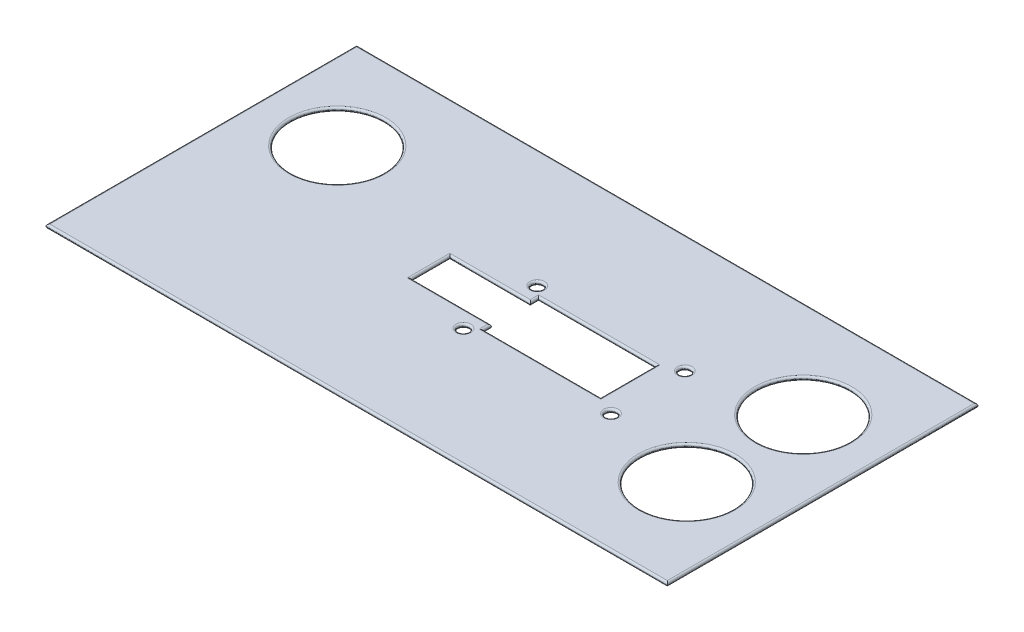
ISO-10303-21;
HEADER;
FILE_DESCRIPTION(('STEP AP214'),'2;1');
FILE_NAME('part.step','',(''),(''),'','','');
FILE_SCHEMA(('AUTOMOTIVE_DESIGN { 1 0 10303 214 1 1 1 1 }'));
ENDSEC;
DATA;
#1=APPLICATION_CONTEXT('core data for automotive mechanical design processes');
#2=APPLICATION_PROTOCOL_DEFINITION('international standard','automotive_design',2000,#1);
#3=PRODUCT_CONTEXT('',#1,'mechanical');
#4=PRODUCT('Part','Part','',(#3));
#5=PRODUCT_RELATED_PRODUCT_CATEGORY('part','',(#4));
#6=PRODUCT_DEFINITION_FORMATION('','',#4);
#7=PRODUCT_DEFINITION_CONTEXT('part definition',#1,'design');
#8=PRODUCT_DEFINITION('design','',#6,#7);
#9=PRODUCT_DEFINITION_SHAPE('','',#8);
#10=(LENGTH_UNIT() NAMED_UNIT(*) SI_UNIT(.MILLI.,.METRE.));
#11=(NAMED_UNIT(*) PLANE_ANGLE_UNIT() SI_UNIT($,.RADIAN.));
#12=(NAMED_UNIT(*) SI_UNIT($,.STERADIAN.) SOLID_ANGLE_UNIT());
#13=UNCERTAINTY_MEASURE_WITH_UNIT(LENGTH_MEASURE(1.E-05),#10,'distance_accuracy_value','');
#14=(GEOMETRIC_REPRESENTATION_CONTEXT(3) GLOBAL_UNCERTAINTY_ASSIGNED_CONTEXT((#13)) GLOBAL_UNIT_ASSIGNED_CONTEXT((#10,
#11,#12)) REPRESENTATION_CONTEXT('',''));
#15=CARTESIAN_POINT('',(0.,0.,0.));
#16=DIRECTION('',(0.,0.,1.));
#17=DIRECTION('',(1.,0.,0.));
#18=AXIS2_PLACEMENT_3D('',#15,#16,#17);
#19=CARTESIAN_POINT('',(0.,1.,0.));
#20=DIRECTION('',(0.,1.,0.));
#21=DIRECTION('',(0.,0.,1.));
#22=AXIS2_PLACEMENT_3D('',#19,#20,#21);
#23=PLANE('',#22);
#24=CARTESIAN_POINT('',(19.,1.,-9.5));
#25=DIRECTION('',(0.,1.,0.));
#26=DIRECTION('',(0.,0.,1.));
#27=AXIS2_PLACEMENT_3D('',#24,#25,#26);
#28=CIRCLE('',#27,1.9);
#29=CARTESIAN_POINT('',(19.,1.,-7.6));
#30=VERTEX_POINT('',#29);
#31=EDGE_CURVE('E11',#30,#30,#28,.F.);
#32=ORIENTED_EDGE('',*,*,#31,.T.);
#33=EDGE_LOOP('',(#32));
#34=FACE_BOUND('',#33,.T.);
#35=CARTESIAN_POINT('',(19.,1.,9.50000000000001));
#36=DIRECTION('',(0.,1.,0.));
#37=DIRECTION('',(0.,0.,1.));
#38=AXIS2_PLACEMENT_3D('',#35,#36,#37);
#39=CIRCLE('',#38,1.9);
#40=CARTESIAN_POINT('',(19.,1.,11.4));
#41=VERTEX_POINT('',#40);
#42=EDGE_CURVE('E47',#41,#41,#39,.F.);
#43=ORIENTED_EDGE('',*,*,#42,.T.);
#44=EDGE_LOOP('',(#43));
#45=FACE_BOUND('',#44,.T.);
#46=DIRECTION('',(-1.,0.,0.));
#47=VECTOR('',#46,1.);
#48=CARTESIAN_POINT('',(0.,1.,-7.65));
#49=LINE('',#48,#47);
#50=CARTESIAN_POINT('',(-16.8,1.,-7.65));
#51=VERTEX_POINT('',#50);
#52=CARTESIAN_POINT('',(14.5,1.,-7.65));
#53=VERTEX_POINT('',#52);
#54=EDGE_CURVE('E59',#51,#53,#49,.F.);
#55=ORIENTED_EDGE('',*,*,#54,.T.);
#56=DIRECTION('',(0.,0.,-1.));
#57=VECTOR('',#56,1.);
#58=CARTESIAN_POINT('',(14.5,1.,0.));
#59=LINE('',#58,#57);
#60=CARTESIAN_POINT('',(14.5,1.,7.65));
#61=VERTEX_POINT('',#60);
#62=EDGE_CURVE('E359',#53,#61,#59,.F.);
#63=ORIENTED_EDGE('',*,*,#62,.T.);
#64=DIRECTION('',(1.,0.,0.));
#65=VECTOR('',#64,1.);
#66=CARTESIAN_POINT('',(0.,1.,7.65));
#67=LINE('',#66,#65);
#68=CARTESIAN_POINT('',(-16.8,1.,7.65));
#69=VERTEX_POINT('',#68);
#70=EDGE_CURVE('E336',#61,#69,#67,.F.);
#71=ORIENTED_EDGE('',*,*,#70,.T.);
#72=DIRECTION('',(0.,0.,1.));
#73=VECTOR('',#72,1.);
#74=CARTESIAN_POINT('',(-16.8,1.,0.));
#75=LINE('',#74,#73);
#76=CARTESIAN_POINT('',(-16.8,1.,5.5));
#77=VERTEX_POINT('',#76);
#78=EDGE_CURVE('E344',#69,#77,#75,.F.);
#79=ORIENTED_EDGE('',*,*,#78,.T.);
#80=DIRECTION('',(1.,0.,0.));
#81=VECTOR('',#80,1.);
#82=CARTESIAN_POINT('',(0.,1.,5.5));
#83=LINE('',#82,#81);
#84=CARTESIAN_POINT('',(-37.5,1.,5.5));
#85=VERTEX_POINT('',#84);
#86=EDGE_CURVE('E347',#77,#85,#83,.F.);
#87=ORIENTED_EDGE('',*,*,#86,.T.);
#88=DIRECTION('',(0.,0.,1.));
#89=VECTOR('',#88,1.);
#90=CARTESIAN_POINT('',(-37.5,1.,0.));
#91=LINE('',#90,#89);
#92=CARTESIAN_POINT('',(-37.5,1.,-5.5));
#93=VERTEX_POINT('',#92);
#94=EDGE_CURVE('E349',#85,#93,#91,.F.);
#95=ORIENTED_EDGE('',*,*,#94,.T.);
#96=DIRECTION('',(-1.,0.,0.));
#97=VECTOR('',#96,1.);
#98=CARTESIAN_POINT('',(0.,1.,-5.5));
#99=LINE('',#98,#97);
#100=CARTESIAN_POINT('',(-16.8,1.,-5.5));
#101=VERTEX_POINT('',#100);
#102=EDGE_CURVE('E355',#93,#101,#99,.F.);
#103=ORIENTED_EDGE('',*,*,#102,.T.);
#104=DIRECTION('',(0.,0.,1.));
#105=VECTOR('',#104,1.);
#106=CARTESIAN_POINT('',(-16.8,1.,0.));
#107=LINE('',#106,#105);
#108=EDGE_CURVE('E351',#101,#51,#107,.F.);
#109=ORIENTED_EDGE('',*,*,#108,.T.);
#110=EDGE_LOOP('',(#55,#63,#71,#79,#87,#95,#103,#109));
#111=FACE_BOUND('',#110,.T.);
#112=CARTESIAN_POINT('',(44.,1.,15.));
#113=DIRECTION('',(0.,1.,0.));
#114=DIRECTION('',(0.,0.,1.));
#115=AXIS2_PLACEMENT_3D('',#112,#113,#114);
#116=CIRCLE('',#115,12.5);
#117=CARTESIAN_POINT('',(44.,1.,27.5));
#118=VERTEX_POINT('',#117);
#119=EDGE_CURVE('E340',#118,#118,#116,.F.);
#120=ORIENTED_EDGE('',*,*,#119,.T.);
#121=EDGE_LOOP('',(#120));
#122=FACE_BOUND('',#121,.T.);
#123=CARTESIAN_POINT('',(44.,1.,-15.));
#124=DIRECTION('',(0.,1.,0.));
#125=DIRECTION('',(0.,0.,1.));
#126=AXIS2_PLACEMENT_3D('',#123,#124,#125);
#127=CIRCLE('',#126,12.5);
#128=CARTESIAN_POINT('',(44.,1.,-2.49999999999998));
#129=VERTEX_POINT('',#128);
#130=EDGE_CURVE('E331',#129,#129,#127,.F.);
#131=ORIENTED_EDGE('',*,*,#130,.T.);
#132=EDGE_LOOP('',(#131));
#133=FACE_BOUND('',#132,.T.);
#134=DIRECTION('',(0.,0.,-1.));
#135=VECTOR('',#134,1.);
#136=CARTESIAN_POINT('',(63.5,1.,-40.));
#137=LINE('',#136,#135);
#138=CARTESIAN_POINT('',(63.5000000000001,1.,39.5));
#139=VERTEX_POINT('',#138);
#140=CARTESIAN_POINT('',(63.5,1.,-39.5));
#141=VERTEX_POINT('',#140);
#142=EDGE_CURVE('E328',#139,#141,#137,.T.);
#143=ORIENTED_EDGE('',*,*,#142,.T.);
#144=DIRECTION('',(-1.,0.,0.));
#145=VECTOR('',#144,1.);
#146=CARTESIAN_POINT('',(-96.,1.,-39.5));
#147=LINE('',#146,#145);
#148=CARTESIAN_POINT('',(-95.5,1.,-39.5));
#149=VERTEX_POINT('',#148);
#150=EDGE_CURVE('E335',#141,#149,#147,.T.);
#151=ORIENTED_EDGE('',*,*,#150,.T.);
#152=DIRECTION('',(0.,0.,1.));
#153=VECTOR('',#152,1.);
#154=CARTESIAN_POINT('',(-95.5,1.,40.));
#155=LINE('',#154,#153);
#156=CARTESIAN_POINT('',(-95.5,1.,39.5));
#157=VERTEX_POINT('',#156);
#158=EDGE_CURVE('E111',#149,#157,#155,.T.);
#159=ORIENTED_EDGE('',*,*,#158,.T.);
#160=DIRECTION('',(1.,0.,0.));
#161=VECTOR('',#160,1.);
#162=CARTESIAN_POINT('',(64.,1.,39.5));
#163=LINE('',#162,#161);
#164=EDGE_CURVE('E319',#157,#139,#163,.T.);
#165=ORIENTED_EDGE('',*,*,#164,.T.);
#166=EDGE_LOOP('',(#143,#151,#159,#165));
#167=FACE_BOUND('',#166,.T.);
#168=CARTESIAN_POINT('',(-76.,1.,-15.));
#169=DIRECTION('',(0.,1.,0.));
#170=DIRECTION('',(0.,0.,1.));
#171=AXIS2_PLACEMENT_3D('',#168,#169,#170);
#172=CIRCLE('',#171,12.5);
#173=CARTESIAN_POINT('',(-76.,1.,-2.50000000000001));
#174=VERTEX_POINT('',#173);
#175=EDGE_CURVE('E316',#174,#174,#172,.F.);
#176=ORIENTED_EDGE('',*,*,#175,.T.);
#177=EDGE_LOOP('',(#176));
#178=FACE_BOUND('',#177,.T.);
#179=CARTESIAN_POINT('',(-19.,1.,9.49999999999999));
#180=DIRECTION('',(0.,1.,0.));
#181=DIRECTION('',(0.,0.,1.));
#182=AXIS2_PLACEMENT_3D('',#179,#180,#181);
#183=CIRCLE('',#182,1.9);
#184=CARTESIAN_POINT('',(-19.,1.,11.4));
#185=VERTEX_POINT('',#184);
#186=EDGE_CURVE('E318',#185,#185,#183,.F.);
#187=ORIENTED_EDGE('',*,*,#186,.T.);
#188=EDGE_LOOP('',(#187));
#189=FACE_BOUND('',#188,.T.);
#190=CARTESIAN_POINT('',(-19.,1.,-9.5));
#191=DIRECTION('',(0.,1.,0.));
#192=DIRECTION('',(0.,0.,1.));
#193=AXIS2_PLACEMENT_3D('',#190,#191,#192);
#194=CIRCLE('',#193,1.9);
#195=CARTESIAN_POINT('',(-19.,1.,-7.6));
#196=VERTEX_POINT('',#195);
#197=EDGE_CURVE('E323',#196,#196,#194,.F.);
#198=ORIENTED_EDGE('',*,*,#197,.T.);
#199=EDGE_LOOP('',(#198));
#200=FACE_BOUND('',#199,.T.);
#201=ADVANCED_FACE('F39',(#34,#45,#111,#122,#133,#167,#178,#189,#200),#23,.T.);
#202=CARTESIAN_POINT('',(0.,0.,0.));
#203=DIRECTION('',(0.,1.,0.));
#204=DIRECTION('',(0.,0.,1.));
#205=AXIS2_PLACEMENT_3D('',#202,#203,#204);
#206=PLANE('',#205);
#207=CARTESIAN_POINT('',(19.,0.,-9.5));
#208=DIRECTION('',(0.,1.,0.));
#209=DIRECTION('',(0.,0.,1.));
#210=AXIS2_PLACEMENT_3D('',#207,#208,#209);
#211=CIRCLE('',#210,1.9);
#212=CARTESIAN_POINT('',(19.,0.,-7.6));
#213=VERTEX_POINT('',#212);
#214=EDGE_CURVE('E559',#213,#213,#211,.T.);
#215=ORIENTED_EDGE('',*,*,#214,.T.);
#216=EDGE_LOOP('',(#215));
#217=FACE_BOUND('',#216,.T.);
#218=CARTESIAN_POINT('',(-19.,0.,-9.5));
#219=DIRECTION('',(0.,1.,0.));
#220=DIRECTION('',(0.,0.,1.));
#221=AXIS2_PLACEMENT_3D('',#218,#219,#220);
#222=CIRCLE('',#221,1.9);
#223=CARTESIAN_POINT('',(-19.,0.,-7.6));
#224=VERTEX_POINT('',#223);
#225=EDGE_CURVE('E557',#224,#224,#222,.T.);
#226=ORIENTED_EDGE('',*,*,#225,.T.);
#227=EDGE_LOOP('',(#226));
#228=FACE_BOUND('',#227,.T.);
#229=CARTESIAN_POINT('',(19.,0.,9.50000000000001));
#230=DIRECTION('',(0.,1.,0.));
#231=DIRECTION('',(0.,0.,1.));
#232=AXIS2_PLACEMENT_3D('',#229,#230,#231);
#233=CIRCLE('',#232,1.9);
#234=CARTESIAN_POINT('',(19.,0.,11.4));
#235=VERTEX_POINT('',#234);
#236=EDGE_CURVE('E554',#235,#235,#233,.T.);
#237=ORIENTED_EDGE('',*,*,#236,.T.);
#238=EDGE_LOOP('',(#237));
#239=FACE_BOUND('',#238,.T.);
#240=CARTESIAN_POINT('',(-19.,0.,9.49999999999999));
#241=DIRECTION('',(0.,1.,0.));
#242=DIRECTION('',(0.,0.,1.));
#243=AXIS2_PLACEMENT_3D('',#240,#241,#242);
#244=CIRCLE('',#243,1.9);
#245=CARTESIAN_POINT('',(-19.,0.,11.4));
#246=VERTEX_POINT('',#245);
#247=EDGE_CURVE('E546',#246,#246,#244,.T.);
#248=ORIENTED_EDGE('',*,*,#247,.T.);
#249=EDGE_LOOP('',(#248));
#250=FACE_BOUND('',#249,.T.);
#251=DIRECTION('',(0.,0.,1.));
#252=VECTOR('',#251,1.);
#253=CARTESIAN_POINT('',(-37.5,0.,5.));
#254=LINE('',#253,#252);
#255=CARTESIAN_POINT('',(-37.5,0.,-5.5));
#256=VERTEX_POINT('',#255);
#257=CARTESIAN_POINT('',(-37.5,0.,5.5));
#258=VERTEX_POINT('',#257);
#259=EDGE_CURVE('E539',#256,#258,#254,.T.);
#260=ORIENTED_EDGE('',*,*,#259,.T.);
#261=DIRECTION('',(1.,0.,0.));
#262=VECTOR('',#261,1.);
#263=CARTESIAN_POINT('',(-16.3,0.,5.5));
#264=LINE('',#263,#262);
#265=CARTESIAN_POINT('',(-16.8,0.,5.5));
#266=VERTEX_POINT('',#265);
#267=EDGE_CURVE('E542',#258,#266,#264,.T.);
#268=ORIENTED_EDGE('',*,*,#267,.T.);
#269=DIRECTION('',(0.,0.,1.));
#270=VECTOR('',#269,1.);
#271=CARTESIAN_POINT('',(-16.8,0.,7.15));
#272=LINE('',#271,#270);
#273=CARTESIAN_POINT('',(-16.8,0.,7.65));
#274=VERTEX_POINT('',#273);
#275=EDGE_CURVE('E596',#266,#274,#272,.T.);
#276=ORIENTED_EDGE('',*,*,#275,.T.);
#277=DIRECTION('',(1.,0.,0.));
#278=VECTOR('',#277,1.);
#279=CARTESIAN_POINT('',(14.,0.,7.65));
#280=LINE('',#279,#278);
#281=CARTESIAN_POINT('',(14.5,0.,7.65));
#282=VERTEX_POINT('',#281);
#283=EDGE_CURVE('E598',#274,#282,#280,.T.);
#284=ORIENTED_EDGE('',*,*,#283,.T.);
#285=DIRECTION('',(0.,0.,-1.));
#286=VECTOR('',#285,1.);
#287=CARTESIAN_POINT('',(14.5,0.,-7.15));
#288=LINE('',#287,#286);
#289=CARTESIAN_POINT('',(14.5,0.,-7.65));
#290=VERTEX_POINT('',#289);
#291=EDGE_CURVE('E599',#282,#290,#288,.T.);
#292=ORIENTED_EDGE('',*,*,#291,.T.);
#293=DIRECTION('',(-1.,0.,0.));
#294=VECTOR('',#293,1.);
#295=CARTESIAN_POINT('',(-16.3,0.,-7.65));
#296=LINE('',#295,#294);
#297=CARTESIAN_POINT('',(-16.8,0.,-7.65));
#298=VERTEX_POINT('',#297);
#299=EDGE_CURVE('E526',#290,#298,#296,.T.);
#300=ORIENTED_EDGE('',*,*,#299,.T.);
#301=DIRECTION('',(0.,0.,1.));
#302=VECTOR('',#301,1.);
#303=CARTESIAN_POINT('',(-16.8,0.,-5.));
#304=LINE('',#303,#302);
#305=CARTESIAN_POINT('',(-16.8,0.,-5.5));
#306=VERTEX_POINT('',#305);
#307=EDGE_CURVE('E523',#298,#306,#304,.T.);
#308=ORIENTED_EDGE('',*,*,#307,.T.);
#309=DIRECTION('',(-1.,0.,0.));
#310=VECTOR('',#309,1.);
#311=CARTESIAN_POINT('',(-37.,0.,-5.5));
#312=LINE('',#311,#310);
#313=EDGE_CURVE('E522',#306,#256,#312,.T.);
#314=ORIENTED_EDGE('',*,*,#313,.T.);
#315=EDGE_LOOP('',(#260,#268,#276,#284,#292,#300,#308,#314));
#316=FACE_BOUND('',#315,.T.);
#317=DIRECTION('',(0.,0.,-1.));
#318=VECTOR('',#317,1.);
#319=CARTESIAN_POINT('',(63.5,0.,0.));
#320=LINE('',#319,#318);
#321=CARTESIAN_POINT('',(63.5,0.,-39.5));
#322=VERTEX_POINT('',#321);
#323=CARTESIAN_POINT('',(63.5000000000001,0.,39.5));
#324=VERTEX_POINT('',#323);
#325=EDGE_CURVE('E469',#322,#324,#320,.F.);
#326=ORIENTED_EDGE('',*,*,#325,.T.);
#327=DIRECTION('',(1.,0.,0.));
#328=VECTOR('',#327,1.);
#329=CARTESIAN_POINT('',(0.,0.,39.5));
#330=LINE('',#329,#328);
#331=CARTESIAN_POINT('',(-95.5,0.,39.5));
#332=VERTEX_POINT('',#331);
#333=EDGE_CURVE('E592',#324,#332,#330,.F.);
#334=ORIENTED_EDGE('',*,*,#333,.T.);
#335=DIRECTION('',(0.,0.,1.));
#336=VECTOR('',#335,1.);
#337=CARTESIAN_POINT('',(-95.5,0.,0.));
#338=LINE('',#337,#336);
#339=CARTESIAN_POINT('',(-95.5,0.,-39.5));
#340=VERTEX_POINT('',#339);
#341=EDGE_CURVE('E587',#332,#340,#338,.F.);
#342=ORIENTED_EDGE('',*,*,#341,.T.);
#343=DIRECTION('',(-1.,0.,0.));
#344=VECTOR('',#343,1.);
#345=CARTESIAN_POINT('',(0.,0.,-39.5));
#346=LINE('',#345,#344);
#347=EDGE_CURVE('E132',#340,#322,#346,.F.);
#348=ORIENTED_EDGE('',*,*,#347,.T.);
#349=EDGE_LOOP('',(#326,#334,#342,#348));
#350=FACE_BOUND('',#349,.T.);
#351=CARTESIAN_POINT('',(44.,0.,-15.));
#352=DIRECTION('',(0.,1.,0.));
#353=DIRECTION('',(0.,0.,1.));
#354=AXIS2_PLACEMENT_3D('',#351,#352,#353);
#355=CIRCLE('',#354,12.5);
#356=CARTESIAN_POINT('',(44.,0.,-2.49999999999998));
#357=VERTEX_POINT('',#356);
#358=EDGE_CURVE('E578',#357,#357,#355,.T.);
#359=ORIENTED_EDGE('',*,*,#358,.T.);
#360=EDGE_LOOP('',(#359));
#361=FACE_BOUND('',#360,.T.);
#362=CARTESIAN_POINT('',(-76.,0.,-15.));
#363=DIRECTION('',(0.,1.,0.));
#364=DIRECTION('',(0.,0.,1.));
#365=AXIS2_PLACEMENT_3D('',#362,#363,#364);
#366=CIRCLE('',#365,12.5);
#367=CARTESIAN_POINT('',(-76.,0.,-2.50000000000001));
#368=VERTEX_POINT('',#367);
#369=EDGE_CURVE('E581',#368,#368,#366,.T.);
#370=ORIENTED_EDGE('',*,*,#369,.T.);
#371=EDGE_LOOP('',(#370));
#372=FACE_BOUND('',#371,.T.);
#373=CARTESIAN_POINT('',(44.,0.,15.));
#374=DIRECTION('',(0.,1.,0.));
#375=DIRECTION('',(0.,0.,1.));
#376=AXIS2_PLACEMENT_3D('',#373,#374,#375);
#377=CIRCLE('',#376,12.5);
#378=CARTESIAN_POINT('',(44.,0.,27.5));
#379=VERTEX_POINT('',#378);
#380=EDGE_CURVE('E364',#379,#379,#377,.T.);
#381=ORIENTED_EDGE('',*,*,#380,.T.);
#382=EDGE_LOOP('',(#381));
#383=FACE_BOUND('',#382,.T.);
#384=ADVANCED_FACE('F172',(#217,#228,#239,#250,#316,#350,#361,#372,#383),#206,.F.);
#385=CARTESIAN_POINT('',(19.,0.5,-9.5));
#386=DIRECTION('',(0.,1.,0.));
#387=DIRECTION('',(0.,0.,1.));
#388=AXIS2_PLACEMENT_3D('',#385,#386,#387);
#389=TOROIDAL_SURFACE('',#388,1.9,0.5);
#390=ORIENTED_EDGE('',*,*,#31,.F.);
#391=EDGE_LOOP('',(#390));
#392=FACE_BOUND('',#391,.T.);
#393=CARTESIAN_POINT('',(19.,0.5,-9.5));
#394=DIRECTION('',(0.,1.,0.));
#395=DIRECTION('',(0.,0.,1.));
#396=AXIS2_PLACEMENT_3D('',#393,#394,#395);
#397=CIRCLE('',#396,1.4);
#398=CARTESIAN_POINT('',(19.,0.5,-8.1));
#399=VERTEX_POINT('',#398);
#400=EDGE_CURVE('E362',#399,#399,#397,.T.);
#401=ORIENTED_EDGE('',*,*,#400,.F.);
#402=EDGE_LOOP('',(#401));
#403=FACE_BOUND('',#402,.T.);
#404=ADVANCED_FACE('F177',(#392,#403),#389,.T.);
#405=CARTESIAN_POINT('',(19.,0.5,-9.5));
#406=DIRECTION('',(0.,1.,0.));
#407=DIRECTION('',(0.,0.,1.));
#408=AXIS2_PLACEMENT_3D('',#405,#406,#407);
#409=TOROIDAL_SURFACE('',#408,1.9,0.5);
#410=ORIENTED_EDGE('',*,*,#400,.T.);
#411=EDGE_LOOP('',(#410));
#412=FACE_BOUND('',#411,.T.);
#413=ORIENTED_EDGE('',*,*,#214,.F.);
#414=EDGE_LOOP('',(#413));
#415=FACE_BOUND('',#414,.T.);
#416=ADVANCED_FACE('F185',(#412,#415),#409,.T.);
#417=CARTESIAN_POINT('',(-19.,0.5,-9.5));
#418=DIRECTION('',(0.,1.,0.));
#419=DIRECTION('',(0.,0.,1.));
#420=AXIS2_PLACEMENT_3D('',#417,#418,#419);
#421=TOROIDAL_SURFACE('',#420,1.9,0.5);
#422=ORIENTED_EDGE('',*,*,#197,.F.);
#423=EDGE_LOOP('',(#422));
#424=FACE_BOUND('',#423,.T.);
#425=CARTESIAN_POINT('',(-19.,0.5,-9.5));
#426=DIRECTION('',(0.,1.,0.));
#427=DIRECTION('',(0.,0.,1.));
#428=AXIS2_PLACEMENT_3D('',#425,#426,#427);
#429=CIRCLE('',#428,1.4);
#430=CARTESIAN_POINT('',(-19.,0.5,-8.1));
#431=VERTEX_POINT('',#430);
#432=EDGE_CURVE('E368',#431,#431,#429,.T.);
#433=ORIENTED_EDGE('',*,*,#432,.F.);
#434=EDGE_LOOP('',(#433));
#435=FACE_BOUND('',#434,.T.);
#436=ADVANCED_FACE('F183',(#424,#435),#421,.T.);
#437=CARTESIAN_POINT('',(-19.,0.5,-9.5));
#438=DIRECTION('',(0.,1.,0.));
#439=DIRECTION('',(0.,0.,1.));
#440=AXIS2_PLACEMENT_3D('',#437,#438,#439);
#441=TOROIDAL_SURFACE('',#440,1.9,0.5);
#442=ORIENTED_EDGE('',*,*,#432,.T.);
#443=EDGE_LOOP('',(#442));
#444=FACE_BOUND('',#443,.T.);
#445=ORIENTED_EDGE('',*,*,#225,.F.);
#446=EDGE_LOOP('',(#445));
#447=FACE_BOUND('',#446,.T.);
#448=ADVANCED_FACE('F186',(#444,#447),#441,.T.);
#449=CARTESIAN_POINT('',(19.,0.5,9.50000000000001));
#450=DIRECTION('',(0.,1.,0.));
#451=DIRECTION('',(0.,0.,1.));
#452=AXIS2_PLACEMENT_3D('',#449,#450,#451);
#453=TOROIDAL_SURFACE('',#452,1.9,0.5);
#454=ORIENTED_EDGE('',*,*,#42,.F.);
#455=EDGE_LOOP('',(#454));
#456=FACE_BOUND('',#455,.T.);
#457=CARTESIAN_POINT('',(19.,0.5,9.50000000000001));
#458=DIRECTION('',(0.,1.,0.));
#459=DIRECTION('',(0.,0.,1.));
#460=AXIS2_PLACEMENT_3D('',#457,#458,#459);
#461=CIRCLE('',#460,1.4);
#462=CARTESIAN_POINT('',(19.,0.5,10.9));
#463=VERTEX_POINT('',#462);
#464=EDGE_CURVE('E369',#463,#463,#461,.T.);
#465=ORIENTED_EDGE('',*,*,#464,.F.);
#466=EDGE_LOOP('',(#465));
#467=FACE_BOUND('',#466,.T.);
#468=ADVANCED_FACE('F194',(#456,#467),#453,.T.);
#469=CARTESIAN_POINT('',(19.,0.5,9.50000000000001));
#470=DIRECTION('',(0.,1.,0.));
#471=DIRECTION('',(0.,0.,1.));
#472=AXIS2_PLACEMENT_3D('',#469,#470,#471);
#473=TOROIDAL_SURFACE('',#472,1.9,0.5);
#474=ORIENTED_EDGE('',*,*,#464,.T.);
#475=EDGE_LOOP('',(#474));
#476=FACE_BOUND('',#475,.T.);
#477=ORIENTED_EDGE('',*,*,#236,.F.);
#478=EDGE_LOOP('',(#477));
#479=FACE_BOUND('',#478,.T.);
#480=ADVANCED_FACE('F196',(#476,#479),#473,.T.);
#481=CARTESIAN_POINT('',(-19.,0.5,9.49999999999999));
#482=DIRECTION('',(0.,1.,0.));
#483=DIRECTION('',(0.,0.,1.));
#484=AXIS2_PLACEMENT_3D('',#481,#482,#483);
#485=TOROIDAL_SURFACE('',#484,1.9,0.5);
#486=ORIENTED_EDGE('',*,*,#186,.F.);
#487=EDGE_LOOP('',(#486));
#488=FACE_BOUND('',#487,.T.);
#489=CARTESIAN_POINT('',(-19.,0.5,9.49999999999999));
#490=DIRECTION('',(0.,1.,0.));
#491=DIRECTION('',(0.,0.,1.));
#492=AXIS2_PLACEMENT_3D('',#489,#490,#491);
#493=CIRCLE('',#492,1.4);
#494=CARTESIAN_POINT('',(-19.,0.5,10.9));
#495=VERTEX_POINT('',#494);
#496=EDGE_CURVE('E375',#495,#495,#493,.T.);
#497=ORIENTED_EDGE('',*,*,#496,.F.);
#498=EDGE_LOOP('',(#497));
#499=FACE_BOUND('',#498,.T.);
#500=ADVANCED_FACE('F203',(#488,#499),#485,.T.);
#501=CARTESIAN_POINT('',(-19.,0.5,9.49999999999999));
#502=DIRECTION('',(0.,1.,0.));
#503=DIRECTION('',(0.,0.,1.));
#504=AXIS2_PLACEMENT_3D('',#501,#502,#503);
#505=TOROIDAL_SURFACE('',#504,1.9,0.5);
#506=ORIENTED_EDGE('',*,*,#496,.T.);
#507=EDGE_LOOP('',(#506));
#508=FACE_BOUND('',#507,.T.);
#509=ORIENTED_EDGE('',*,*,#247,.F.);
#510=EDGE_LOOP('',(#509));
#511=FACE_BOUND('',#510,.T.);
#512=ADVANCED_FACE('F206',(#508,#511),#505,.T.);
#513=CARTESIAN_POINT('',(-16.3,0.5,-7.65));
#514=DIRECTION('',(-1.,0.,0.));
#515=DIRECTION('',(0.,0.,1.));
#516=AXIS2_PLACEMENT_3D('',#513,#514,#515);
#517=CYLINDRICAL_SURFACE('',#516,0.5);
#518=CARTESIAN_POINT('',(14.5,0.5,-7.65));
#519=DIRECTION('',(-0.707106781186548,0.,-0.707106781186547));
#520=DIRECTION('',(0.707106781186547,0.,-0.707106781186548));
#521=AXIS2_PLACEMENT_3D('',#518,#519,#520);
#522=ELLIPSE('',#521,0.707106781186547,0.5);
#523=CARTESIAN_POINT('',(14.,0.5,-7.15));
#524=VERTEX_POINT('',#523);
#525=EDGE_CURVE('E440',#53,#524,#522,.F.);
#526=ORIENTED_EDGE('',*,*,#525,.F.);
#527=ORIENTED_EDGE('',*,*,#54,.F.);
#528=CARTESIAN_POINT('',(-16.8,0.5,-7.65));
#529=DIRECTION('',(-0.707106781186549,0.,0.707106781186546));
#530=DIRECTION('',(-0.707106781186546,0.,-0.707106781186549));
#531=AXIS2_PLACEMENT_3D('',#528,#529,#530);
#532=ELLIPSE('',#531,0.707106781186546,0.5);
#533=CARTESIAN_POINT('',(-16.3,0.5,-7.15));
#534=VERTEX_POINT('',#533);
#535=EDGE_CURVE('E374',#534,#51,#532,.T.);
#536=ORIENTED_EDGE('',*,*,#535,.F.);
#537=DIRECTION('',(-1.,0.,0.));
#538=VECTOR('',#537,1.);
#539=CARTESIAN_POINT('',(-16.3,0.5,-7.15));
#540=LINE('',#539,#538);
#541=EDGE_CURVE('E439',#524,#534,#540,.T.);
#542=ORIENTED_EDGE('',*,*,#541,.F.);
#543=EDGE_LOOP('',(#526,#527,#536,#542));
#544=FACE_BOUND('',#543,.T.);
#545=ADVANCED_FACE('F207',(#544),#517,.T.);
#546=CARTESIAN_POINT('',(-16.8,0.5,-5.));
#547=DIRECTION('',(0.,0.,1.));
#548=DIRECTION('',(1.,0.,0.));
#549=AXIS2_PLACEMENT_3D('',#546,#547,#548);
#550=CYLINDRICAL_SURFACE('',#549,0.5);
#551=ORIENTED_EDGE('',*,*,#535,.T.);
#552=ORIENTED_EDGE('',*,*,#108,.F.);
#553=CARTESIAN_POINT('',(-16.8,0.5,-5.5));
#554=DIRECTION('',(-0.707106781186549,0.,0.707106781186546));
#555=DIRECTION('',(-0.707106781186546,0.,-0.707106781186549));
#556=AXIS2_PLACEMENT_3D('',#553,#554,#555);
#557=ELLIPSE('',#556,0.707106781186546,0.5);
#558=CARTESIAN_POINT('',(-16.3,0.5,-5.));
#559=VERTEX_POINT('',#558);
#560=EDGE_CURVE('E432',#559,#101,#557,.T.);
#561=ORIENTED_EDGE('',*,*,#560,.F.);
#562=DIRECTION('',(0.,0.,1.));
#563=VECTOR('',#562,1.);
#564=CARTESIAN_POINT('',(-16.3,0.5,-5.));
#565=LINE('',#564,#563);
#566=EDGE_CURVE('E431',#534,#559,#565,.T.);
#567=ORIENTED_EDGE('',*,*,#566,.F.);
#568=EDGE_LOOP('',(#551,#552,#561,#567));
#569=FACE_BOUND('',#568,.T.);
#570=ADVANCED_FACE('F267',(#569),#550,.T.);
#571=CARTESIAN_POINT('',(0.,0.5,-7.65));
#572=DIRECTION('',(1.,0.,0.));
#573=DIRECTION('',(0.,0.,-1.));
#574=AXIS2_PLACEMENT_3D('',#571,#572,#573);
#575=CYLINDRICAL_SURFACE('',#574,0.5);
#576=CARTESIAN_POINT('',(14.5,0.5,-7.65));
#577=DIRECTION('',(0.707106781186548,0.,0.707106781186547));
#578=DIRECTION('',(0.707106781186547,0.,-0.707106781186548));
#579=AXIS2_PLACEMENT_3D('',#576,#577,#578);
#580=ELLIPSE('',#579,0.707106781186547,0.5);
#581=EDGE_CURVE('E422',#524,#290,#580,.T.);
#582=ORIENTED_EDGE('',*,*,#581,.F.);
#583=ORIENTED_EDGE('',*,*,#541,.T.);
#584=CARTESIAN_POINT('',(-16.8,0.5,-7.65));
#585=DIRECTION('',(0.707106781186549,0.,-0.707106781186546));
#586=DIRECTION('',(-0.707106781186546,0.,-0.707106781186549));
#587=AXIS2_PLACEMENT_3D('',#584,#585,#586);
#588=ELLIPSE('',#587,0.707106781186546,0.5);
#589=EDGE_CURVE('E428',#298,#534,#588,.F.);
#590=ORIENTED_EDGE('',*,*,#589,.F.);
#591=ORIENTED_EDGE('',*,*,#299,.F.);
#592=EDGE_LOOP('',(#582,#583,#590,#591));
#593=FACE_BOUND('',#592,.T.);
#594=ADVANCED_FACE('F264',(#593),#575,.T.);
#595=CARTESIAN_POINT('',(14.5,0.5,-7.15));
#596=DIRECTION('',(0.,0.,-1.));
#597=DIRECTION('',(-1.,0.,0.));
#598=AXIS2_PLACEMENT_3D('',#595,#596,#597);
#599=CYLINDRICAL_SURFACE('',#598,0.5);
#600=ORIENTED_EDGE('',*,*,#62,.F.);
#601=ORIENTED_EDGE('',*,*,#525,.T.);
#602=DIRECTION('',(0.,0.,-1.));
#603=VECTOR('',#602,1.);
#604=CARTESIAN_POINT('',(14.,0.5,-7.15));
#605=LINE('',#604,#603);
#606=CARTESIAN_POINT('',(14.,0.5,7.15));
#607=VERTEX_POINT('',#606);
#608=EDGE_CURVE('E425',#607,#524,#605,.T.);
#609=ORIENTED_EDGE('',*,*,#608,.F.);
#610=CARTESIAN_POINT('',(14.5,0.5,7.65));
#611=DIRECTION('',(0.707106781186547,0.,-0.707106781186548));
#612=DIRECTION('',(-0.707106781186548,0.,-0.707106781186547));
#613=AXIS2_PLACEMENT_3D('',#610,#611,#612);
#614=ELLIPSE('',#613,0.707106781186548,0.5);
#615=EDGE_CURVE('E420',#61,#607,#614,.F.);
#616=ORIENTED_EDGE('',*,*,#615,.F.);
#617=EDGE_LOOP('',(#600,#601,#609,#616));
#618=FACE_BOUND('',#617,.T.);
#619=ADVANCED_FACE('F261',(#618),#599,.T.);
#620=CARTESIAN_POINT('',(-37.,0.5,-5.5));
#621=DIRECTION('',(-1.,0.,0.));
#622=DIRECTION('',(0.,0.,1.));
#623=AXIS2_PLACEMENT_3D('',#620,#621,#622);
#624=CYLINDRICAL_SURFACE('',#623,0.5);
#625=ORIENTED_EDGE('',*,*,#560,.T.);
#626=ORIENTED_EDGE('',*,*,#102,.F.);
#627=CARTESIAN_POINT('',(-37.5,0.5,-5.5));
#628=DIRECTION('',(-0.707106781186547,0.,0.707106781186548));
#629=DIRECTION('',(-0.707106781186548,0.,-0.707106781186547));
#630=AXIS2_PLACEMENT_3D('',#627,#628,#629);
#631=ELLIPSE('',#630,0.707106781186547,0.5);
#632=CARTESIAN_POINT('',(-37.,0.5,-5.));
#633=VERTEX_POINT('',#632);
#634=EDGE_CURVE('E418',#633,#93,#631,.T.);
#635=ORIENTED_EDGE('',*,*,#634,.F.);
#636=DIRECTION('',(-1.,0.,0.));
#637=VECTOR('',#636,1.);
#638=CARTESIAN_POINT('',(-37.,0.5,-5.));
#639=LINE('',#638,#637);
#640=EDGE_CURVE('E414',#559,#633,#639,.T.);
#641=ORIENTED_EDGE('',*,*,#640,.F.);
#642=EDGE_LOOP('',(#625,#626,#635,#641));
#643=FACE_BOUND('',#642,.T.);
#644=ADVANCED_FACE('F260',(#643),#624,.T.);
#645=CARTESIAN_POINT('',(-16.8,0.5,0.));
#646=DIRECTION('',(0.,0.,-1.));
#647=DIRECTION('',(-1.,0.,0.));
#648=AXIS2_PLACEMENT_3D('',#645,#646,#647);
#649=CYLINDRICAL_SURFACE('',#648,0.5);
#650=ORIENTED_EDGE('',*,*,#589,.T.);
#651=ORIENTED_EDGE('',*,*,#566,.T.);
#652=CARTESIAN_POINT('',(-16.8,0.5,-5.5));
#653=DIRECTION('',(0.707106781186549,0.,-0.707106781186546));
#654=DIRECTION('',(-0.707106781186546,0.,-0.707106781186549));
#655=AXIS2_PLACEMENT_3D('',#652,#653,#654);
#656=ELLIPSE('',#655,0.707106781186546,0.5);
#657=EDGE_CURVE('E406',#306,#559,#656,.F.);
#658=ORIENTED_EDGE('',*,*,#657,.F.);
#659=ORIENTED_EDGE('',*,*,#307,.F.);
#660=EDGE_LOOP('',(#650,#651,#658,#659));
#661=FACE_BOUND('',#660,.T.);
#662=ADVANCED_FACE('F251',(#661),#649,.T.);
#663=CARTESIAN_POINT('',(14.5,0.5,0.));
#664=DIRECTION('',(0.,0.,1.));
#665=DIRECTION('',(1.,0.,0.));
#666=AXIS2_PLACEMENT_3D('',#663,#664,#665);
#667=CYLINDRICAL_SURFACE('',#666,0.5);
#668=ORIENTED_EDGE('',*,*,#581,.T.);
#669=ORIENTED_EDGE('',*,*,#291,.F.);
#670=CARTESIAN_POINT('',(14.5,0.5,7.65));
#671=DIRECTION('',(-0.707106781186547,0.,0.707106781186548));
#672=DIRECTION('',(0.707106781186548,0.,0.707106781186547));
#673=AXIS2_PLACEMENT_3D('',#670,#671,#672);
#674=ELLIPSE('',#673,0.707106781186548,0.5);
#675=EDGE_CURVE('E410',#607,#282,#674,.T.);
#676=ORIENTED_EDGE('',*,*,#675,.F.);
#677=ORIENTED_EDGE('',*,*,#608,.T.);
#678=EDGE_LOOP('',(#668,#669,#676,#677));
#679=FACE_BOUND('',#678,.T.);
#680=ADVANCED_FACE('F248',(#679),#667,.T.);
#681=CARTESIAN_POINT('',(-16.3,0.5,7.65));
#682=DIRECTION('',(1.,0.,0.));
#683=DIRECTION('',(0.,0.,-1.));
#684=AXIS2_PLACEMENT_3D('',#681,#682,#683);
#685=CYLINDRICAL_SURFACE('',#684,0.5);
#686=ORIENTED_EDGE('',*,*,#70,.F.);
#687=ORIENTED_EDGE('',*,*,#615,.T.);
#688=DIRECTION('',(1.,0.,0.));
#689=VECTOR('',#688,1.);
#690=CARTESIAN_POINT('',(-16.3,0.5,7.15));
#691=LINE('',#690,#689);
#692=CARTESIAN_POINT('',(-16.3,0.5,7.15));
#693=VERTEX_POINT('',#692);
#694=EDGE_CURVE('E404',#693,#607,#691,.T.);
#695=ORIENTED_EDGE('',*,*,#694,.F.);
#696=CARTESIAN_POINT('',(-16.8,0.5,7.65));
#697=DIRECTION('',(0.707106781186549,0.,0.707106781186546));
#698=DIRECTION('',(-0.707106781186546,0.,0.707106781186549));
#699=AXIS2_PLACEMENT_3D('',#696,#697,#698);
#700=ELLIPSE('',#699,0.707106781186546,0.5);
#701=EDGE_CURVE('E402',#69,#693,#700,.F.);
#702=ORIENTED_EDGE('',*,*,#701,.F.);
#703=EDGE_LOOP('',(#686,#687,#695,#702));
#704=FACE_BOUND('',#703,.T.);
#705=ADVANCED_FACE('F241',(#704),#685,.T.);
#706=CARTESIAN_POINT('',(-37.5,0.5,-5.));
#707=DIRECTION('',(0.,0.,1.));
#708=DIRECTION('',(1.,0.,0.));
#709=AXIS2_PLACEMENT_3D('',#706,#707,#708);
#710=CYLINDRICAL_SURFACE('',#709,0.5);
#711=ORIENTED_EDGE('',*,*,#634,.T.);
#712=ORIENTED_EDGE('',*,*,#94,.F.);
#713=CARTESIAN_POINT('',(-37.5,0.5,5.5));
#714=DIRECTION('',(0.707106781186548,0.,0.707106781186547));
#715=DIRECTION('',(-0.707106781186547,0.,0.707106781186548));
#716=AXIS2_PLACEMENT_3D('',#713,#714,#715);
#717=ELLIPSE('',#716,0.707106781186548,0.5);
#718=CARTESIAN_POINT('',(-37.,0.5,5.));
#719=VERTEX_POINT('',#718);
#720=EDGE_CURVE('E396',#719,#85,#717,.T.);
#721=ORIENTED_EDGE('',*,*,#720,.F.);
#722=DIRECTION('',(0.,0.,1.));
#723=VECTOR('',#722,1.);
#724=CARTESIAN_POINT('',(-37.,0.5,-5.));
#725=LINE('',#724,#723);
#726=EDGE_CURVE('E393',#633,#719,#725,.T.);
#727=ORIENTED_EDGE('',*,*,#726,.F.);
#728=EDGE_LOOP('',(#711,#712,#721,#727));
#729=FACE_BOUND('',#728,.T.);
#730=ADVANCED_FACE('F242',(#729),#710,.T.);
#731=CARTESIAN_POINT('',(0.,0.5,-5.5));
#732=DIRECTION('',(1.,0.,0.));
#733=DIRECTION('',(0.,0.,-1.));
#734=AXIS2_PLACEMENT_3D('',#731,#732,#733);
#735=CYLINDRICAL_SURFACE('',#734,0.5);
#736=ORIENTED_EDGE('',*,*,#657,.T.);
#737=ORIENTED_EDGE('',*,*,#640,.T.);
#738=CARTESIAN_POINT('',(-37.5,0.5,-5.5));
#739=DIRECTION('',(0.707106781186547,0.,-0.707106781186548));
#740=DIRECTION('',(-0.707106781186548,0.,-0.707106781186547));
#741=AXIS2_PLACEMENT_3D('',#738,#739,#740);
#742=ELLIPSE('',#741,0.707106781186547,0.5);
#743=EDGE_CURVE('E388',#256,#633,#742,.F.);
#744=ORIENTED_EDGE('',*,*,#743,.F.);
#745=ORIENTED_EDGE('',*,*,#313,.F.);
#746=EDGE_LOOP('',(#736,#737,#744,#745));
#747=FACE_BOUND('',#746,.T.);
#748=ADVANCED_FACE('F240',(#747),#735,.T.);
#749=CARTESIAN_POINT('',(0.,0.5,7.65));
#750=DIRECTION('',(-1.,0.,0.));
#751=DIRECTION('',(0.,0.,1.));
#752=AXIS2_PLACEMENT_3D('',#749,#750,#751);
#753=CYLINDRICAL_SURFACE('',#752,0.5);
#754=ORIENTED_EDGE('',*,*,#675,.T.);
#755=ORIENTED_EDGE('',*,*,#283,.F.);
#756=CARTESIAN_POINT('',(-16.8,0.5,7.65));
#757=DIRECTION('',(-0.707106781186549,0.,-0.707106781186546));
#758=DIRECTION('',(-0.707106781186546,0.,0.707106781186549));
#759=AXIS2_PLACEMENT_3D('',#756,#757,#758);
#760=ELLIPSE('',#759,0.707106781186546,0.5);
#761=EDGE_CURVE('E390',#693,#274,#760,.T.);
#762=ORIENTED_EDGE('',*,*,#761,.F.);
#763=ORIENTED_EDGE('',*,*,#694,.T.);
#764=EDGE_LOOP('',(#754,#755,#762,#763));
#765=FACE_BOUND('',#764,.T.);
#766=ADVANCED_FACE('F234',(#765),#753,.T.);
#767=CARTESIAN_POINT('',(-16.8,0.5,7.15));
#768=DIRECTION('',(0.,0.,1.));
#769=DIRECTION('',(1.,0.,0.));
#770=AXIS2_PLACEMENT_3D('',#767,#768,#769);
#771=CYLINDRICAL_SURFACE('',#770,0.5);
#772=CARTESIAN_POINT('',(-16.8,0.5,5.5));
#773=DIRECTION('',(0.707106781186549,0.,0.707106781186546));
#774=DIRECTION('',(-0.707106781186546,0.,0.707106781186549));
#775=AXIS2_PLACEMENT_3D('',#772,#773,#774);
#776=ELLIPSE('',#775,0.707106781186547,0.5);
#777=CARTESIAN_POINT('',(-16.3,0.5,5.));
#778=VERTEX_POINT('',#777);
#779=EDGE_CURVE('E398',#77,#778,#776,.F.);
#780=ORIENTED_EDGE('',*,*,#779,.F.);
#781=ORIENTED_EDGE('',*,*,#78,.F.);
#782=ORIENTED_EDGE('',*,*,#701,.T.);
#783=DIRECTION('',(0.,0.,1.));
#784=VECTOR('',#783,1.);
#785=CARTESIAN_POINT('',(-16.3,0.5,7.15));
#786=LINE('',#785,#784);
#787=EDGE_CURVE('E383',#778,#693,#786,.T.);
#788=ORIENTED_EDGE('',*,*,#787,.F.);
#789=EDGE_LOOP('',(#780,#781,#782,#788));
#790=FACE_BOUND('',#789,.T.);
#791=ADVANCED_FACE('F229',(#790),#771,.T.);
#792=CARTESIAN_POINT('',(-37.,0.5,5.5));
#793=DIRECTION('',(1.,0.,0.));
#794=DIRECTION('',(0.,0.,-1.));
#795=AXIS2_PLACEMENT_3D('',#792,#793,#794);
#796=CYLINDRICAL_SURFACE('',#795,0.5);
#797=ORIENTED_EDGE('',*,*,#86,.F.);
#798=ORIENTED_EDGE('',*,*,#779,.T.);
#799=DIRECTION('',(1.,0.,0.));
#800=VECTOR('',#799,1.);
#801=CARTESIAN_POINT('',(-37.,0.5,5.));
#802=LINE('',#801,#800);
#803=EDGE_CURVE('E381',#719,#778,#802,.T.);
#804=ORIENTED_EDGE('',*,*,#803,.F.);
#805=ORIENTED_EDGE('',*,*,#720,.T.);
#806=EDGE_LOOP('',(#797,#798,#804,#805));
#807=FACE_BOUND('',#806,.T.);
#808=ADVANCED_FACE('F223',(#807),#796,.T.);
#809=CARTESIAN_POINT('',(-37.5,0.5,0.));
#810=DIRECTION('',(0.,0.,-1.));
#811=DIRECTION('',(-1.,0.,0.));
#812=AXIS2_PLACEMENT_3D('',#809,#810,#811);
#813=CYLINDRICAL_SURFACE('',#812,0.5);
#814=ORIENTED_EDGE('',*,*,#743,.T.);
#815=ORIENTED_EDGE('',*,*,#726,.T.);
#816=CARTESIAN_POINT('',(-37.5,0.5,5.5));
#817=DIRECTION('',(-0.707106781186548,0.,-0.707106781186547));
#818=DIRECTION('',(-0.707106781186547,0.,0.707106781186548));
#819=AXIS2_PLACEMENT_3D('',#816,#817,#818);
#820=ELLIPSE('',#819,0.707106781186548,0.5);
#821=EDGE_CURVE('E378',#258,#719,#820,.F.);
#822=ORIENTED_EDGE('',*,*,#821,.F.);
#823=ORIENTED_EDGE('',*,*,#259,.F.);
#824=EDGE_LOOP('',(#814,#815,#822,#823));
#825=FACE_BOUND('',#824,.T.);
#826=ADVANCED_FACE('F222',(#825),#813,.T.);
#827=CARTESIAN_POINT('',(-16.8,0.5,0.));
#828=DIRECTION('',(0.,0.,-1.));
#829=DIRECTION('',(-1.,0.,0.));
#830=AXIS2_PLACEMENT_3D('',#827,#828,#829);
#831=CYLINDRICAL_SURFACE('',#830,0.5);
#832=ORIENTED_EDGE('',*,*,#761,.T.);
#833=ORIENTED_EDGE('',*,*,#275,.F.);
#834=CARTESIAN_POINT('',(-16.8,0.5,5.5));
#835=DIRECTION('',(-0.707106781186549,0.,-0.707106781186546));
#836=DIRECTION('',(0.707106781186546,0.,-0.707106781186549));
#837=AXIS2_PLACEMENT_3D('',#834,#835,#836);
#838=ELLIPSE('',#837,0.707106781186547,0.5);
#839=EDGE_CURVE('E117',#778,#266,#838,.T.);
#840=ORIENTED_EDGE('',*,*,#839,.F.);
#841=ORIENTED_EDGE('',*,*,#787,.T.);
#842=EDGE_LOOP('',(#832,#833,#840,#841));
#843=FACE_BOUND('',#842,.T.);
#844=ADVANCED_FACE('F220',(#843),#831,.T.);
#845=CARTESIAN_POINT('',(0.,0.5,5.5));
#846=DIRECTION('',(-1.,0.,0.));
#847=DIRECTION('',(0.,0.,1.));
#848=AXIS2_PLACEMENT_3D('',#845,#846,#847);
#849=CYLINDRICAL_SURFACE('',#848,0.5);
#850=ORIENTED_EDGE('',*,*,#821,.T.);
#851=ORIENTED_EDGE('',*,*,#803,.T.);
#852=ORIENTED_EDGE('',*,*,#839,.T.);
#853=ORIENTED_EDGE('',*,*,#267,.F.);
#854=EDGE_LOOP('',(#850,#851,#852,#853));
#855=FACE_BOUND('',#854,.T.);
#856=ADVANCED_FACE('F212',(#855),#849,.T.);
#857=CARTESIAN_POINT('',(0.,0.5,-39.5));
#858=DIRECTION('',(1.,0.,0.));
#859=DIRECTION('',(0.,0.,-1.));
#860=AXIS2_PLACEMENT_3D('',#857,#858,#859);
#861=CYLINDRICAL_SURFACE('',#860,0.5);
#862=CARTESIAN_POINT('',(-95.5,0.5,-39.5));
#863=DIRECTION('',(0.707106781186547,0.,-0.707106781186548));
#864=DIRECTION('',(-0.707106781186548,0.,-0.707106781186547));
#865=AXIS2_PLACEMENT_3D('',#862,#863,#864);
#866=ELLIPSE('',#865,0.707106781186547,0.5);
#867=CARTESIAN_POINT('',(-96.,0.5,-40.));
#868=VERTEX_POINT('',#867);
#869=EDGE_CURVE('E106',#149,#868,#866,.F.);
#870=ORIENTED_EDGE('',*,*,#869,.F.);
#871=ORIENTED_EDGE('',*,*,#150,.F.);
#872=CARTESIAN_POINT('',(63.5,0.5,-39.5));
#873=DIRECTION('',(0.707106781186548,0.,0.707106781186547));
#874=DIRECTION('',(-0.707106781186547,0.,0.707106781186548));
#875=AXIS2_PLACEMENT_3D('',#872,#873,#874);
#876=ELLIPSE('',#875,0.707106781186547,0.5);
#877=CARTESIAN_POINT('',(64.,0.5,-40.));
#878=VERTEX_POINT('',#877);
#879=EDGE_CURVE('E99',#878,#141,#876,.T.);
#880=ORIENTED_EDGE('',*,*,#879,.F.);
#881=DIRECTION('',(-1.,0.,0.));
#882=VECTOR('',#881,1.);
#883=CARTESIAN_POINT('',(64.,0.5,-40.));
#884=LINE('',#883,#882);
#885=EDGE_CURVE('E118',#868,#878,#884,.F.);
#886=ORIENTED_EDGE('',*,*,#885,.F.);
#887=EDGE_LOOP('',(#870,#871,#880,#886));
#888=FACE_BOUND('',#887,.T.);
#889=ADVANCED_FACE('F116',(#888),#861,.T.);
#890=CARTESIAN_POINT('',(-95.5,0.5,0.));
#891=DIRECTION('',(0.,0.,-1.));
#892=DIRECTION('',(-1.,0.,0.));
#893=AXIS2_PLACEMENT_3D('',#890,#891,#892);
#894=CYLINDRICAL_SURFACE('',#893,0.5);
#895=ORIENTED_EDGE('',*,*,#158,.F.);
#896=ORIENTED_EDGE('',*,*,#869,.T.);
#897=DIRECTION('',(0.,0.,1.));
#898=VECTOR('',#897,1.);
#899=CARTESIAN_POINT('',(-96.,0.5,-40.));
#900=LINE('',#899,#898);
#901=CARTESIAN_POINT('',(-96.,0.5,40.));
#902=VERTEX_POINT('',#901);
#903=EDGE_CURVE('E109',#902,#868,#900,.F.);
#904=ORIENTED_EDGE('',*,*,#903,.F.);
#905=CARTESIAN_POINT('',(-95.5,0.5,39.5));
#906=DIRECTION('',(-0.707106781186547,0.,-0.707106781186547));
#907=DIRECTION('',(0.707106781186547,0.,-0.707106781186547));
#908=AXIS2_PLACEMENT_3D('',#905,#906,#907);
#909=ELLIPSE('',#908,0.707106781186547,0.5);
#910=EDGE_CURVE('E140',#157,#902,#909,.F.);
#911=ORIENTED_EDGE('',*,*,#910,.F.);
#912=EDGE_LOOP('',(#895,#896,#904,#911));
#913=FACE_BOUND('',#912,.T.);
#914=ADVANCED_FACE('F110',(#913),#894,.T.);
#915=CARTESIAN_POINT('',(63.5,0.5,0.));
#916=DIRECTION('',(0.,0.,1.));
#917=DIRECTION('',(1.,0.,0.));
#918=AXIS2_PLACEMENT_3D('',#915,#916,#917);
#919=CYLINDRICAL_SURFACE('',#918,0.5);
#920=ORIENTED_EDGE('',*,*,#879,.T.);
#921=ORIENTED_EDGE('',*,*,#142,.F.);
#922=CARTESIAN_POINT('',(63.5000000000001,0.5,39.5));
#923=DIRECTION('',(-0.707106781186547,0.,0.707106781186548));
#924=DIRECTION('',(-0.707106781186548,0.,-0.707106781186547));
#925=AXIS2_PLACEMENT_3D('',#922,#923,#924);
#926=ELLIPSE('',#925,0.707106781186548,0.5);
#927=CARTESIAN_POINT('',(64.,0.5,40.));
#928=VERTEX_POINT('',#927);
#929=EDGE_CURVE('E142',#928,#139,#926,.T.);
#930=ORIENTED_EDGE('',*,*,#929,.F.);
#931=DIRECTION('',(0.,0.,-1.));
#932=VECTOR('',#931,1.);
#933=CARTESIAN_POINT('',(64.0000000000001,0.5,40.));
#934=LINE('',#933,#932);
#935=EDGE_CURVE('E454',#878,#928,#934,.F.);
#936=ORIENTED_EDGE('',*,*,#935,.F.);
#937=EDGE_LOOP('',(#920,#921,#930,#936));
#938=FACE_BOUND('',#937,.T.);
#939=ADVANCED_FACE('F294',(#938),#919,.T.);
#940=CARTESIAN_POINT('',(64.,0.5,-39.5));
#941=DIRECTION('',(-1.,0.,0.));
#942=DIRECTION('',(0.,0.,1.));
#943=AXIS2_PLACEMENT_3D('',#940,#941,#942);
#944=CYLINDRICAL_SURFACE('',#943,0.5);
#945=CARTESIAN_POINT('',(63.5,0.5,-39.5));
#946=DIRECTION('',(-0.707106781186548,0.,-0.707106781186547));
#947=DIRECTION('',(-0.707106781186547,0.,0.707106781186548));
#948=AXIS2_PLACEMENT_3D('',#945,#946,#947);
#949=ELLIPSE('',#948,0.707106781186547,0.5);
#950=EDGE_CURVE('E446',#322,#878,#949,.F.);
#951=ORIENTED_EDGE('',*,*,#950,.F.);
#952=ORIENTED_EDGE('',*,*,#347,.F.);
#953=CARTESIAN_POINT('',(-95.5,0.5,-39.5));
#954=DIRECTION('',(-0.707106781186547,0.,0.707106781186548));
#955=DIRECTION('',(0.707106781186548,0.,0.707106781186547));
#956=AXIS2_PLACEMENT_3D('',#953,#954,#955);
#957=ELLIPSE('',#956,0.707106781186547,0.5);
#958=EDGE_CURVE('E123',#868,#340,#957,.T.);
#959=ORIENTED_EDGE('',*,*,#958,.F.);
#960=ORIENTED_EDGE('',*,*,#885,.T.);
#961=EDGE_LOOP('',(#951,#952,#959,#960));
#962=FACE_BOUND('',#961,.T.);
#963=ADVANCED_FACE('F126',(#962),#944,.T.);
#964=CARTESIAN_POINT('',(-95.5,0.5,-15.));
#965=DIRECTION('',(0.,0.,1.));
#966=DIRECTION('',(1.,0.,0.));
#967=AXIS2_PLACEMENT_3D('',#964,#965,#966);
#968=CYLINDRICAL_SURFACE('',#967,0.5);
#969=ORIENTED_EDGE('',*,*,#958,.T.);
#970=ORIENTED_EDGE('',*,*,#341,.F.);
#971=CARTESIAN_POINT('',(-95.5,0.5,39.5));
#972=DIRECTION('',(0.707106781186547,0.,0.707106781186547));
#973=DIRECTION('',(-0.707106781186547,0.,0.707106781186547));
#974=AXIS2_PLACEMENT_3D('',#971,#972,#973);
#975=ELLIPSE('',#974,0.707106781186547,0.5);
#976=EDGE_CURVE('E139',#902,#332,#975,.T.);
#977=ORIENTED_EDGE('',*,*,#976,.F.);
#978=ORIENTED_EDGE('',*,*,#903,.T.);
#979=EDGE_LOOP('',(#969,#970,#977,#978));
#980=FACE_BOUND('',#979,.T.);
#981=ADVANCED_FACE('F136',(#980),#968,.T.);
#982=CARTESIAN_POINT('',(0.,0.5,39.5));
#983=DIRECTION('',(-1.,0.,0.));
#984=DIRECTION('',(0.,0.,1.));
#985=AXIS2_PLACEMENT_3D('',#982,#983,#984);
#986=CYLINDRICAL_SURFACE('',#985,0.5);
#987=ORIENTED_EDGE('',*,*,#164,.F.);
#988=ORIENTED_EDGE('',*,*,#910,.T.);
#989=DIRECTION('',(1.,0.,0.));
#990=VECTOR('',#989,1.);
#991=CARTESIAN_POINT('',(-96.,0.5,40.));
#992=LINE('',#991,#990);
#993=EDGE_CURVE('E450',#928,#902,#992,.F.);
#994=ORIENTED_EDGE('',*,*,#993,.F.);
#995=ORIENTED_EDGE('',*,*,#929,.T.);
#996=EDGE_LOOP('',(#987,#988,#994,#995));
#997=FACE_BOUND('',#996,.T.);
#998=ADVANCED_FACE('F281',(#997),#986,.T.);
#999=CARTESIAN_POINT('',(63.5,0.5,-15.));
#1000=DIRECTION('',(0.,0.,-1.));
#1001=DIRECTION('',(-1.,0.,0.));
#1002=AXIS2_PLACEMENT_3D('',#999,#1000,#1001);
#1003=CYLINDRICAL_SURFACE('',#1002,0.5);
#1004=ORIENTED_EDGE('',*,*,#950,.T.);
#1005=ORIENTED_EDGE('',*,*,#935,.T.);
#1006=CARTESIAN_POINT('',(63.5000000000001,0.5,39.5));
#1007=DIRECTION('',(0.707106781186547,0.,-0.707106781186548));
#1008=DIRECTION('',(-0.707106781186548,0.,-0.707106781186547));
#1009=AXIS2_PLACEMENT_3D('',#1006,#1007,#1008);
#1010=ELLIPSE('',#1009,0.707106781186548,0.5);
#1011=EDGE_CURVE('E149',#324,#928,#1010,.F.);
#1012=ORIENTED_EDGE('',*,*,#1011,.F.);
#1013=ORIENTED_EDGE('',*,*,#325,.F.);
#1014=EDGE_LOOP('',(#1004,#1005,#1012,#1013));
#1015=FACE_BOUND('',#1014,.T.);
#1016=ADVANCED_FACE('F282',(#1015),#1003,.T.);
#1017=CARTESIAN_POINT('',(-96.,0.5,39.5));
#1018=DIRECTION('',(1.,0.,0.));
#1019=DIRECTION('',(0.,0.,-1.));
#1020=AXIS2_PLACEMENT_3D('',#1017,#1018,#1019);
#1021=CYLINDRICAL_SURFACE('',#1020,0.5);
#1022=ORIENTED_EDGE('',*,*,#976,.T.);
#1023=ORIENTED_EDGE('',*,*,#333,.F.);
#1024=ORIENTED_EDGE('',*,*,#1011,.T.);
#1025=ORIENTED_EDGE('',*,*,#993,.T.);
#1026=EDGE_LOOP('',(#1022,#1023,#1024,#1025));
#1027=FACE_BOUND('',#1026,.T.);
#1028=ADVANCED_FACE('F280',(#1027),#1021,.T.);
#1029=CARTESIAN_POINT('',(44.,0.5,-15.));
#1030=DIRECTION('',(0.,1.,0.));
#1031=DIRECTION('',(0.,0.,1.));
#1032=AXIS2_PLACEMENT_3D('',#1029,#1030,#1031);
#1033=TOROIDAL_SURFACE('',#1032,12.5,0.5);
#1034=ORIENTED_EDGE('',*,*,#130,.F.);
#1035=EDGE_LOOP('',(#1034));
#1036=FACE_BOUND('',#1035,.T.);
#1037=CARTESIAN_POINT('',(44.,0.5,-15.));
#1038=DIRECTION('',(0.,1.,0.));
#1039=DIRECTION('',(0.,0.,1.));
#1040=AXIS2_PLACEMENT_3D('',#1037,#1038,#1039);
#1041=CIRCLE('',#1040,12.);
#1042=CARTESIAN_POINT('',(44.,0.5,-2.99999999999998));
#1043=VERTEX_POINT('',#1042);
#1044=EDGE_CURVE('E150',#1043,#1043,#1041,.T.);
#1045=ORIENTED_EDGE('',*,*,#1044,.F.);
#1046=EDGE_LOOP('',(#1045));
#1047=FACE_BOUND('',#1046,.T.);
#1048=ADVANCED_FACE('F278',(#1036,#1047),#1033,.T.);
#1049=CARTESIAN_POINT('',(44.,0.5,-15.));
#1050=DIRECTION('',(0.,1.,0.));
#1051=DIRECTION('',(0.,0.,1.));
#1052=AXIS2_PLACEMENT_3D('',#1049,#1050,#1051);
#1053=TOROIDAL_SURFACE('',#1052,12.5,0.5);
#1054=ORIENTED_EDGE('',*,*,#1044,.T.);
#1055=EDGE_LOOP('',(#1054));
#1056=FACE_BOUND('',#1055,.T.);
#1057=ORIENTED_EDGE('',*,*,#358,.F.);
#1058=EDGE_LOOP('',(#1057));
#1059=FACE_BOUND('',#1058,.T.);
#1060=ADVANCED_FACE('F302',(#1056,#1059),#1053,.T.);
#1061=CARTESIAN_POINT('',(-76.,0.5,-15.));
#1062=DIRECTION('',(0.,1.,0.));
#1063=DIRECTION('',(0.,0.,1.));
#1064=AXIS2_PLACEMENT_3D('',#1061,#1062,#1063);
#1065=TOROIDAL_SURFACE('',#1064,12.5,0.5);
#1066=ORIENTED_EDGE('',*,*,#175,.F.);
#1067=EDGE_LOOP('',(#1066));
#1068=FACE_BOUND('',#1067,.T.);
#1069=CARTESIAN_POINT('',(-76.,0.5,-15.));
#1070=DIRECTION('',(0.,1.,0.));
#1071=DIRECTION('',(0.,0.,1.));
#1072=AXIS2_PLACEMENT_3D('',#1069,#1070,#1071);
#1073=CIRCLE('',#1072,12.);
#1074=CARTESIAN_POINT('',(-76.,0.5,-3.00000000000001));
#1075=VERTEX_POINT('',#1074);
#1076=EDGE_CURVE('E147',#1075,#1075,#1073,.T.);
#1077=ORIENTED_EDGE('',*,*,#1076,.F.);
#1078=EDGE_LOOP('',(#1077));
#1079=FACE_BOUND('',#1078,.T.);
#1080=ADVANCED_FACE('F170',(#1068,#1079),#1065,.T.);
#1081=CARTESIAN_POINT('',(-76.,0.5,-15.));
#1082=DIRECTION('',(0.,1.,0.));
#1083=DIRECTION('',(0.,0.,1.));
#1084=AXIS2_PLACEMENT_3D('',#1081,#1082,#1083);
#1085=TOROIDAL_SURFACE('',#1084,12.5,0.5);
#1086=ORIENTED_EDGE('',*,*,#1076,.T.);
#1087=EDGE_LOOP('',(#1086));
#1088=FACE_BOUND('',#1087,.T.);
#1089=ORIENTED_EDGE('',*,*,#369,.F.);
#1090=EDGE_LOOP('',(#1089));
#1091=FACE_BOUND('',#1090,.T.);
#1092=ADVANCED_FACE('F161',(#1088,#1091),#1085,.T.);
#1093=CARTESIAN_POINT('',(44.,0.5,15.));
#1094=DIRECTION('',(0.,1.,0.));
#1095=DIRECTION('',(0.,0.,1.));
#1096=AXIS2_PLACEMENT_3D('',#1093,#1094,#1095);
#1097=TOROIDAL_SURFACE('',#1096,12.5,0.5);
#1098=ORIENTED_EDGE('',*,*,#119,.F.);
#1099=EDGE_LOOP('',(#1098));
#1100=FACE_BOUND('',#1099,.T.);
#1101=CARTESIAN_POINT('',(44.,0.5,15.));
#1102=DIRECTION('',(0.,1.,0.));
#1103=DIRECTION('',(0.,0.,1.));
#1104=AXIS2_PLACEMENT_3D('',#1101,#1102,#1103);
#1105=CIRCLE('',#1104,12.);
#1106=CARTESIAN_POINT('',(44.,0.5,27.));
#1107=VERTEX_POINT('',#1106);
#1108=EDGE_CURVE('E43',#1107,#1107,#1105,.T.);
#1109=ORIENTED_EDGE('',*,*,#1108,.F.);
#1110=EDGE_LOOP('',(#1109));
#1111=FACE_BOUND('',#1110,.T.);
#1112=ADVANCED_FACE('F41',(#1100,#1111),#1097,.T.);
#1113=CARTESIAN_POINT('',(44.,0.5,15.));
#1114=DIRECTION('',(0.,1.,0.));
#1115=DIRECTION('',(0.,0.,1.));
#1116=AXIS2_PLACEMENT_3D('',#1113,#1114,#1115);
#1117=TOROIDAL_SURFACE('',#1116,12.5,0.5);
#1118=ORIENTED_EDGE('',*,*,#1108,.T.);
#1119=EDGE_LOOP('',(#1118));
#1120=FACE_BOUND('',#1119,.T.);
#1121=ORIENTED_EDGE('',*,*,#380,.F.);
#1122=EDGE_LOOP('',(#1121));
#1123=FACE_BOUND('',#1122,.T.);
#1124=ADVANCED_FACE('F160',(#1120,#1123),#1117,.T.);
#1125=CLOSED_SHELL('',(#201,#384,#404,#416,#436,#448,#468,#480,#500,#512,#545,#570,#594,#619,
#644,#662,#680,#705,#730,#748,#766,#791,#808,#826,#844,#856,#889,#914,#939,#963,#981,#998,#1016,
#1028,#1048,#1060,#1080,#1092,#1112,#1124));
#1126=MANIFOLD_SOLID_BREP('B2',#1125);
#1127=ADVANCED_BREP_SHAPE_REPRESENTATION('',(#18,#1126),#14);
#1128=SHAPE_DEFINITION_REPRESENTATION(#9,#1127);
ENDSEC;
END-ISO-10303-21;
